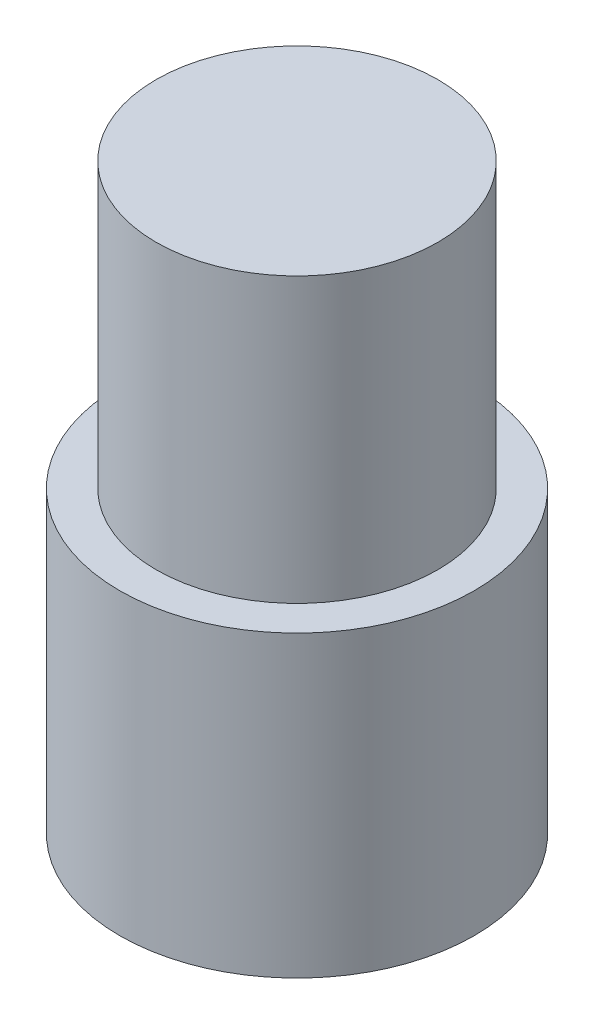
ISO-10303-21;
HEADER;
FILE_DESCRIPTION(('STEP AP214'),'2;1');
FILE_NAME('part.step','',(''),(''),'','','');
FILE_SCHEMA(('AUTOMOTIVE_DESIGN { 1 0 10303 214 1 1 1 1 }'));
ENDSEC;
DATA;
#1=APPLICATION_CONTEXT('core data for automotive mechanical design processes');
#2=APPLICATION_PROTOCOL_DEFINITION('international standard','automotive_design',2000,#1);
#3=PRODUCT_CONTEXT('',#1,'mechanical');
#4=PRODUCT('Part','Part','',(#3));
#5=PRODUCT_RELATED_PRODUCT_CATEGORY('part','',(#4));
#6=PRODUCT_DEFINITION_FORMATION('','',#4);
#7=PRODUCT_DEFINITION_CONTEXT('part definition',#1,'design');
#8=PRODUCT_DEFINITION('design','',#6,#7);
#9=PRODUCT_DEFINITION_SHAPE('','',#8);
#10=(LENGTH_UNIT() NAMED_UNIT(*) SI_UNIT(.MILLI.,.METRE.));
#11=(NAMED_UNIT(*) PLANE_ANGLE_UNIT() SI_UNIT($,.RADIAN.));
#12=(NAMED_UNIT(*) SI_UNIT($,.STERADIAN.) SOLID_ANGLE_UNIT());
#13=UNCERTAINTY_MEASURE_WITH_UNIT(LENGTH_MEASURE(1.E-05),#10,'distance_accuracy_value','');
#14=(GEOMETRIC_REPRESENTATION_CONTEXT(3) GLOBAL_UNCERTAINTY_ASSIGNED_CONTEXT((#13)) GLOBAL_UNIT_ASSIGNED_CONTEXT((#10,
#11,#12)) REPRESENTATION_CONTEXT('',''));
#15=CARTESIAN_POINT('',(0.,0.,0.));
#16=DIRECTION('',(0.,0.,1.));
#17=DIRECTION('',(1.,0.,0.));
#18=AXIS2_PLACEMENT_3D('',#15,#16,#17);
#19=CARTESIAN_POINT('',(0.,101.156250000028,3.46991125293649E-13));
#20=DIRECTION('',(0.,1.,0.));
#21=DIRECTION('',(0.,0.,1.));
#22=AXIS2_PLACEMENT_3D('',#19,#20,#21);
#23=PLANE('',#22);
#24=CARTESIAN_POINT('',(0.,101.156250000028,3.46991125293636E-13));
#25=DIRECTION('',(0.,-1.,0.));
#26=DIRECTION('',(0.,0.,-1.));
#27=AXIS2_PLACEMENT_3D('',#24,#25,#26);
#28=CIRCLE('',#27,39.7500000000003);
#29=CARTESIAN_POINT('',(0.,101.156250000028,-39.75));
#30=VERTEX_POINT('',#29);
#31=EDGE_CURVE('E10',#30,#30,#28,.T.);
#32=ORIENTED_EDGE('',*,*,#31,.F.);
#33=EDGE_LOOP('',(#32));
#34=FACE_BOUND('',#33,.T.);
#35=ADVANCED_FACE('F37',(#34),#23,.T.);
#36=CARTESIAN_POINT('',(0.,-2571.43633150492,-8.82066690184325E-12));
#37=DIRECTION('',(0.,-1.,0.));
#38=DIRECTION('',(0.,0.,-1.));
#39=AXIS2_PLACEMENT_3D('',#36,#37,#38);
#40=CYLINDRICAL_SURFACE('',#39,39.7500000000002);
#41=ORIENTED_EDGE('',*,*,#31,.T.);
#42=EDGE_LOOP('',(#41));
#43=FACE_BOUND('',#42,.T.);
#44=CARTESIAN_POINT('',(0.,21.1562500000286,0.));
#45=DIRECTION('',(0.,-1.,0.));
#46=DIRECTION('',(0.,0.,-1.));
#47=AXIS2_PLACEMENT_3D('',#44,#45,#46);
#48=CIRCLE('',#47,39.7500000000001);
#49=CARTESIAN_POINT('',(0.,21.1562500000288,-39.75));
#50=VERTEX_POINT('',#49);
#51=EDGE_CURVE('E44',#50,#50,#48,.T.);
#52=ORIENTED_EDGE('',*,*,#51,.F.);
#53=EDGE_LOOP('',(#52));
#54=FACE_BOUND('',#53,.T.);
#55=ADVANCED_FACE('F73',(#43,#54),#40,.T.);
#56=CARTESIAN_POINT('',(0.,21.1562500000284,-39.75));
#57=DIRECTION('',(0.,1.,0.));
#58=DIRECTION('',(0.,0.,1.));
#59=AXIS2_PLACEMENT_3D('',#56,#57,#58);
#60=PLANE('',#59);
#61=ORIENTED_EDGE('',*,*,#51,.T.);
#62=EDGE_LOOP('',(#61));
#63=FACE_BOUND('',#62,.T.);
#64=CARTESIAN_POINT('',(0.,21.1562500000286,0.));
#65=DIRECTION('',(0.,-1.,0.));
#66=DIRECTION('',(0.,0.,-1.));
#67=AXIS2_PLACEMENT_3D('',#64,#65,#66);
#68=CIRCLE('',#67,50.0000000000001);
#69=CARTESIAN_POINT('',(0.,21.1562500000288,-50.));
#70=VERTEX_POINT('',#69);
#71=EDGE_CURVE('E49',#70,#70,#68,.T.);
#72=ORIENTED_EDGE('',*,*,#71,.F.);
#73=EDGE_LOOP('',(#72));
#74=FACE_BOUND('',#73,.T.);
#75=ADVANCED_FACE('F65',(#63,#74),#60,.T.);
#76=CARTESIAN_POINT('',(0.,-2571.43633150492,-8.82066690184325E-12));
#77=DIRECTION('',(0.,-1.,0.));
#78=DIRECTION('',(0.,0.,-1.));
#79=AXIS2_PLACEMENT_3D('',#76,#77,#78);
#80=CYLINDRICAL_SURFACE('',#79,49.9999999999999);
#81=ORIENTED_EDGE('',*,*,#71,.T.);
#82=EDGE_LOOP('',(#81));
#83=FACE_BOUND('',#82,.T.);
#84=CARTESIAN_POINT('',(0.,-63.1312499999996,-2.16555907110905E-13));
#85=DIRECTION('',(0.,-1.,0.));
#86=DIRECTION('',(0.,0.,-1.));
#87=AXIS2_PLACEMENT_3D('',#84,#85,#86);
#88=CIRCLE('',#87,49.9999999999998);
#89=CARTESIAN_POINT('',(0.,-63.1312499999995,-50.));
#90=VERTEX_POINT('',#89);
#91=EDGE_CURVE('E54',#90,#90,#88,.T.);
#92=ORIENTED_EDGE('',*,*,#91,.F.);
#93=EDGE_LOOP('',(#92));
#94=FACE_BOUND('',#93,.T.);
#95=ADVANCED_FACE('F63',(#83,#94),#80,.T.);
#96=CARTESIAN_POINT('',(0.,-63.1312499999995,-50.));
#97=DIRECTION('',(0.,-1.,0.));
#98=DIRECTION('',(0.,0.,-1.));
#99=AXIS2_PLACEMENT_3D('',#96,#97,#98);
#100=PLANE('',#99);
#101=ORIENTED_EDGE('',*,*,#91,.T.);
#102=EDGE_LOOP('',(#101));
#103=FACE_BOUND('',#102,.T.);
#104=ADVANCED_FACE('F61',(#103),#100,.T.);
#105=CLOSED_SHELL('',(#35,#55,#75,#95,#104));
#106=MANIFOLD_SOLID_BREP('B2',#105);
#107=ADVANCED_BREP_SHAPE_REPRESENTATION('',(#18,#106),#14);
#108=SHAPE_DEFINITION_REPRESENTATION(#9,#107);
ENDSEC;
END-ISO-10303-21;
